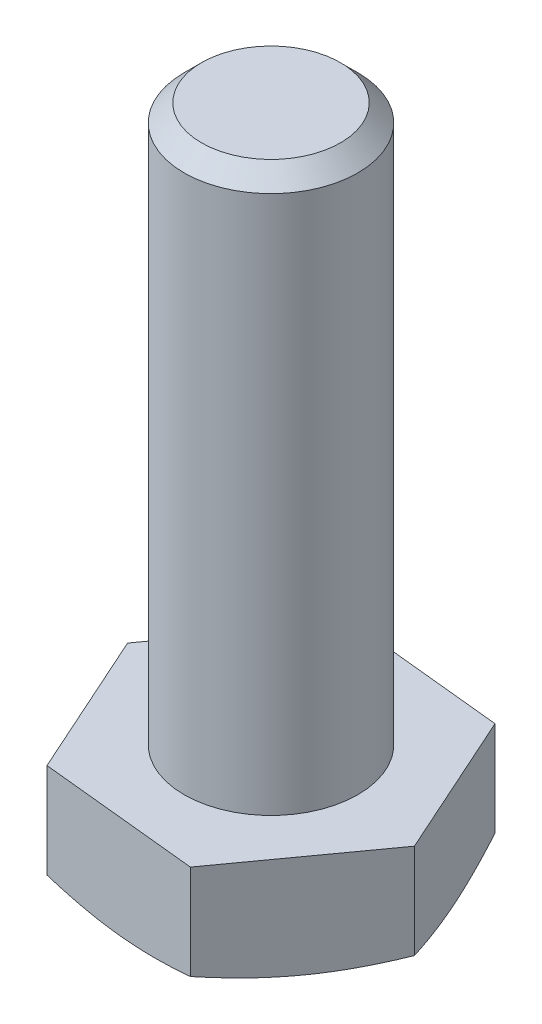
ISO-10303-21;
HEADER;
FILE_DESCRIPTION(('STEP AP214'),'2;1');
FILE_NAME('part.step','',(''),(''),'','','');
FILE_SCHEMA(('AUTOMOTIVE_DESIGN { 1 0 10303 214 1 1 1 1 }'));
ENDSEC;
DATA;
#1=APPLICATION_CONTEXT('core data for automotive mechanical design processes');
#2=APPLICATION_PROTOCOL_DEFINITION('international standard','automotive_design',2000,#1);
#3=PRODUCT_CONTEXT('',#1,'mechanical');
#4=PRODUCT('Part','Part','',(#3));
#5=PRODUCT_RELATED_PRODUCT_CATEGORY('part','',(#4));
#6=PRODUCT_DEFINITION_FORMATION('','',#4);
#7=PRODUCT_DEFINITION_CONTEXT('part definition',#1,'design');
#8=PRODUCT_DEFINITION('design','',#6,#7);
#9=PRODUCT_DEFINITION_SHAPE('','',#8);
#10=(LENGTH_UNIT() NAMED_UNIT(*) SI_UNIT(.MILLI.,.METRE.));
#11=(NAMED_UNIT(*) PLANE_ANGLE_UNIT() SI_UNIT($,.RADIAN.));
#12=(NAMED_UNIT(*) SI_UNIT($,.STERADIAN.) SOLID_ANGLE_UNIT());
#13=UNCERTAINTY_MEASURE_WITH_UNIT(LENGTH_MEASURE(1.E-05),#10,'distance_accuracy_value','');
#14=(GEOMETRIC_REPRESENTATION_CONTEXT(3) GLOBAL_UNCERTAINTY_ASSIGNED_CONTEXT((#13)) GLOBAL_UNIT_ASSIGNED_CONTEXT((#10,
#11,#12)) REPRESENTATION_CONTEXT('',''));
#15=CARTESIAN_POINT('',(0.,0.,0.));
#16=DIRECTION('',(0.,0.,1.));
#17=DIRECTION('',(1.,0.,0.));
#18=AXIS2_PLACEMENT_3D('',#15,#16,#17);
#19=CARTESIAN_POINT('',(2.70244681219402,-3.5,-3.74567945246195));
#20=DIRECTION('',(-0.912190472319559,0.,0.409766448369579));
#21=DIRECTION('',(0.409766448369579,0.,0.912190472319559));
#22=AXIS2_PLACEMENT_3D('',#19,#20,#21);
#23=PLANE('',#22);
#24=CARTESIAN_POINT('',(2.70235696989446,-2.72877918171655,-3.74587945246195));
#25=CARTESIAN_POINT('',(2.78074234099476,-2.76360554364033,-3.57138398322227));
#26=CARTESIAN_POINT('',(2.85938620266857,-2.79528621557615,-3.39631308219876));
#27=CARTESIAN_POINT('',(3.01718530506971,-2.85102354018129,-3.04503288753266));
#28=CARTESIAN_POINT('',(3.09634089685527,-2.8750742262591,-2.86882281239134));
#29=CARTESIAN_POINT('',(3.25428496315666,-2.91397555217697,-2.51721991026795));
#30=CARTESIAN_POINT('',(3.33306983015927,-2.92891104644854,-2.34183511405366));
#31=CARTESIAN_POINT('',(3.49082381468703,-2.94894374989199,-1.99065535731849));
#32=CARTESIAN_POINT('',(3.56979285198263,-2.9540446486007,-1.8148605753984));
#33=CARTESIAN_POINT('',(3.72773092657384,-2.9540446486007,-1.46327101155823));
#34=CARTESIAN_POINT('',(3.80669996386945,-2.94894374989199,-1.28747622963815));
#35=CARTESIAN_POINT('',(3.9644539483972,-2.92891104644854,-0.93629647290297));
#36=CARTESIAN_POINT('',(4.04323881539982,-2.91397555217697,-0.760911676688684));
#37=CARTESIAN_POINT('',(4.20118288170121,-2.8750742262591,-0.409308774565296));
#38=CARTESIAN_POINT('',(4.28033847348676,-2.85102354018129,-0.23309869942397));
#39=CARTESIAN_POINT('',(4.43813757588791,-2.79528621557615,0.11818149524213));
#40=CARTESIAN_POINT('',(4.51678143756171,-2.76360554364033,0.293252396265631));
#41=CARTESIAN_POINT('',(4.59516680866202,-2.72877918171655,0.467747865505321));
#42=B_SPLINE_CURVE_WITH_KNOTS('',3,(#24,#25,#26,#27,#28,#29,#30,#31,#32,#33,#34,#35,#36,#37,#38,
#39,#40,#41),.UNSPECIFIED.,.F.,.F.,(4,2,2,2,2,2,2,2,4),(0.,0.583371669310087,1.16719841276425,
1.74550386907207,2.32359232664833,2.90168078422459,3.47998624053242,4.06381298398658,
4.64718465329667),.UNSPECIFIED.);
#43=CARTESIAN_POINT('',(2.70244681219402,-2.72881908382068,-3.74567945246195));
#44=VERTEX_POINT('',#43);
#45=CARTESIAN_POINT('',(4.59507696636245,-2.72881908382068,0.467547865505321));
#46=VERTEX_POINT('',#45);
#47=EDGE_CURVE('E85',#44,#46,#42,.T.);
#48=ORIENTED_EDGE('',*,*,#47,.F.);
#49=DIRECTION('',(0.,1.,0.));
#50=VECTOR('',#49,1.);
#51=CARTESIAN_POINT('',(2.70244681219402,-3.5,-3.74567945246195));
#52=LINE('',#51,#50);
#53=CARTESIAN_POINT('',(2.70244681219402,0.,-3.74567945246195));
#54=VERTEX_POINT('',#53);
#55=EDGE_CURVE('E54',#44,#54,#52,.T.);
#56=ORIENTED_EDGE('',*,*,#55,.T.);
#57=DIRECTION('',(0.409766448369579,0.,0.912190472319559));
#58=VECTOR('',#57,1.);
#59=CARTESIAN_POINT('',(2.70244681219402,0.,-3.74567945246195));
#60=LINE('',#59,#58);
#61=CARTESIAN_POINT('',(4.59507696636245,0.,0.467547865505321));
#62=VERTEX_POINT('',#61);
#63=EDGE_CURVE('E93',#54,#62,#60,.T.);
#64=ORIENTED_EDGE('',*,*,#63,.T.);
#65=DIRECTION('',(0.,1.,0.));
#66=VECTOR('',#65,1.);
#67=CARTESIAN_POINT('',(4.59507696636245,-3.5,0.467547865505321));
#68=LINE('',#67,#66);
#69=EDGE_CURVE('E92',#46,#62,#68,.T.);
#70=ORIENTED_EDGE('',*,*,#69,.F.);
#71=EDGE_LOOP('',(#48,#56,#64,#70));
#72=FACE_BOUND('',#71,.T.);
#73=ADVANCED_FACE('F31',(#72),#23,.F.);
#74=CARTESIAN_POINT('',(4.59507696636245,-3.5,0.467547865505321));
#75=DIRECTION('',(-0.81096339006636,0.,-0.585096897934074));
#76=DIRECTION('',(-0.585096897934074,0.,0.81096339006636));
#77=AXIS2_PLACEMENT_3D('',#74,#75,#76);
#78=PLANE('',#77);
#79=CARTESIAN_POINT('',(4.59522126311002,-2.72877420080698,0.467347865505321));
#80=CARTESIAN_POINT('',(4.48329512346583,-2.76360128047606,0.622481146784698));
#81=CARTESIAN_POINT('',(4.37099988167168,-2.7952826286654,0.778126015686344));
#82=CARTESIAN_POINT('',(4.14567918833915,-2.85102117165813,1.09042784801914));
#83=CARTESIAN_POINT('',(4.03265323549784,-2.87507239952064,1.24708550627253));
#84=CARTESIAN_POINT('',(3.80712554589694,-2.91397461206453,1.55967424218681));
#85=CARTESIAN_POINT('',(3.69462896050121,-2.92891045468416,1.71559817988932));
#86=CARTESIAN_POINT('',(3.46937269378091,-2.94894362806483,2.02781071483558));
#87=CARTESIAN_POINT('',(3.35661312702318,-2.9540446486007,2.18409915328594));
#88=CARTESIAN_POINT('',(3.13109399350771,-2.9540446486007,2.49667603018666));
#89=CARTESIAN_POINT('',(3.01833442674997,-2.94894362806483,2.65296446863702));
#90=CARTESIAN_POINT('',(2.79307816002967,-2.92891045468416,2.96517700358328));
#91=CARTESIAN_POINT('',(2.68058157463395,-2.91397461206453,3.12110094128579));
#92=CARTESIAN_POINT('',(2.45505388503304,-2.87507239952064,3.43368967720007));
#93=CARTESIAN_POINT('',(2.34202793219173,-2.85102117165814,3.59034733545346));
#94=CARTESIAN_POINT('',(2.11670723885921,-2.7952826286654,3.90264916778625));
#95=CARTESIAN_POINT('',(2.00441199706505,-2.76360128047607,4.0582940366879));
#96=CARTESIAN_POINT('',(1.89248585742086,-2.72877420080698,4.21342731796728));
#97=B_SPLINE_CURVE_WITH_KNOTS('',3,(#79,#80,#81,#82,#83,#84,#85,#86,#87,#88,#89,#90,#91,#92,#93,
#94,#95,#96),.UNSPECIFIED.,.F.,.F.,(4,2,2,2,2,2,2,2,4),(0.,0.583378696848026,1.16721249190064,
1.74552482011727,2.3236201380217,2.90171545592612,3.48002778414276,4.06386157919537,
4.6472402760434),.UNSPECIFIED.);
#98=CARTESIAN_POINT('',(1.89263015416843,-2.72881908382068,4.21322731796728));
#99=VERTEX_POINT('',#98);
#100=EDGE_CURVE('E94',#46,#99,#97,.T.);
#101=ORIENTED_EDGE('',*,*,#100,.F.);
#102=ORIENTED_EDGE('',*,*,#69,.T.);
#103=DIRECTION('',(-0.585096897934074,0.,0.81096339006636));
#104=VECTOR('',#103,1.);
#105=CARTESIAN_POINT('',(4.59507696636245,0.,0.467547865505321));
#106=LINE('',#105,#104);
#107=CARTESIAN_POINT('',(1.89263015416843,0.,4.21322731796728));
#108=VERTEX_POINT('',#107);
#109=EDGE_CURVE('E289',#62,#108,#106,.T.);
#110=ORIENTED_EDGE('',*,*,#109,.T.);
#111=DIRECTION('',(0.,1.,0.));
#112=VECTOR('',#111,1.);
#113=CARTESIAN_POINT('',(1.89263015416843,-3.5,4.21322731796728));
#114=LINE('',#113,#112);
#115=EDGE_CURVE('E111',#99,#108,#114,.T.);
#116=ORIENTED_EDGE('',*,*,#115,.F.);
#117=EDGE_LOOP('',(#101,#102,#110,#116));
#118=FACE_BOUND('',#117,.T.);
#119=ADVANCED_FACE('F134',(#118),#78,.F.);
#120=CARTESIAN_POINT('',(1.89263015416843,-3.5,4.21322731796728));
#121=DIRECTION('',(0.1012270822532,0.,-0.994863346303654));
#122=DIRECTION('',(-0.994863346303654,0.,-0.1012270822532));
#123=AXIS2_PLACEMENT_3D('',#120,#121,#122);
#124=PLANE('',#123);
#125=CARTESIAN_POINT('',(1.89283015416843,-2.72878249767881,4.21324766791436));
#126=CARTESIAN_POINT('',(1.70252144908657,-2.76360838177381,4.1938838075265));
#127=CARTESIAN_POINT('',(1.51158517024263,-2.79528860350394,4.1744560916744));
#128=CARTESIAN_POINT('',(1.12847107139231,-2.85102511698631,4.13547433348543));
#129=CARTESIAN_POINT('',(0.936292399097913,-2.87507544237967,4.11592020442847));
#130=CARTESIAN_POINT('',(0.552826351511705,-2.91397617804077,4.07690263554875));
#131=CARTESIAN_POINT('',(0.361547734518012,-2.92891144040551,4.05744008688049));
#132=CARTESIAN_POINT('',(-0.0214568278398282,-2.94894383099629,4.01846947400064));
#133=CARTESIAN_POINT('',(-0.213182578426313,-2.9540446486007,3.99896142960763));
#134=CARTESIAN_POINT('',(-0.596634079599281,-2.9540446486007,3.9599453408216));
#135=CARTESIAN_POINT('',(-0.788359830185766,-2.94894383099629,3.94043729642859));
#136=CARTESIAN_POINT('',(-1.17136439254361,-2.92891144040551,3.90146668354874));
#137=CARTESIAN_POINT('',(-1.3626430095373,-2.91397617804077,3.88200413488049));
#138=CARTESIAN_POINT('',(-1.74610905712351,-2.87507544237967,3.84298656600076));
#139=CARTESIAN_POINT('',(-1.93828772941791,-2.85102511698631,3.8234324369438));
#140=CARTESIAN_POINT('',(-2.32140182826822,-2.79528860350394,3.78445067875483));
#141=CARTESIAN_POINT('',(-2.51233810711217,-2.76360838177381,3.76502296290273));
#142=CARTESIAN_POINT('',(-2.70264681219402,-2.72878249767881,3.74565910251487));
#143=B_SPLINE_CURVE_WITH_KNOTS('',3,(#125,#126,#127,#128,#129,#130,#131,#132,#133,#134,#135,
#136,#137,#138,#139,#140,#141,#142),.UNSPECIFIED.,.F.,.F.,(4,2,2,2,2,2,2,2,4),(0.,
0.583366990804255,1.16718903973507,1.7454899211441,2.32357381153101,2.90165770191791,
3.47995858332694,4.06378063225776,4.64714762306201),.UNSPECIFIED.);
#144=CARTESIAN_POINT('',(-2.70244681219402,-2.72881908382068,3.74567945246195));
#145=VERTEX_POINT('',#144);
#146=EDGE_CURVE('E182',#99,#145,#143,.T.);
#147=ORIENTED_EDGE('',*,*,#146,.F.);
#148=ORIENTED_EDGE('',*,*,#115,.T.);
#149=DIRECTION('',(-0.994863346303654,0.,-0.1012270822532));
#150=VECTOR('',#149,1.);
#151=CARTESIAN_POINT('',(1.89263015416843,0.,4.21322731796728));
#152=LINE('',#151,#150);
#153=CARTESIAN_POINT('',(-2.70244681219402,0.,3.74567945246195));
#154=VERTEX_POINT('',#153);
#155=EDGE_CURVE('E286',#108,#154,#152,.T.);
#156=ORIENTED_EDGE('',*,*,#155,.T.);
#157=DIRECTION('',(0.,1.,0.));
#158=VECTOR('',#157,1.);
#159=CARTESIAN_POINT('',(-2.70244681219402,-3.5,3.74567945246195));
#160=LINE('',#159,#158);
#161=EDGE_CURVE('E109',#145,#154,#160,.T.);
#162=ORIENTED_EDGE('',*,*,#161,.F.);
#163=EDGE_LOOP('',(#147,#148,#156,#162));
#164=FACE_BOUND('',#163,.T.);
#165=ADVANCED_FACE('F139',(#164),#124,.F.);
#166=CARTESIAN_POINT('',(-2.70244681219402,-3.5,3.74567945246195));
#167=DIRECTION('',(0.912190472319559,0.,-0.409766448369579));
#168=DIRECTION('',(-0.409766448369579,0.,-0.912190472319559));
#169=AXIS2_PLACEMENT_3D('',#166,#167,#168);
#170=PLANE('',#169);
#171=CARTESIAN_POINT('',(-2.70235696989446,-2.72877918171656,3.74587945246195));
#172=CARTESIAN_POINT('',(-2.78074234099476,-2.76360554364033,3.57138398322227));
#173=CARTESIAN_POINT('',(-2.85938620266857,-2.79528621557615,3.39631308219876));
#174=CARTESIAN_POINT('',(-3.01718530506971,-2.85102354018129,3.04503288753266));
#175=CARTESIAN_POINT('',(-3.09634089685527,-2.8750742262591,2.86882281239134));
#176=CARTESIAN_POINT('',(-3.25428496315666,-2.91397555217698,2.51721991026795));
#177=CARTESIAN_POINT('',(-3.33306983015927,-2.92891104644854,2.34183511405366));
#178=CARTESIAN_POINT('',(-3.49082381468703,-2.94894374989199,1.99065535731849));
#179=CARTESIAN_POINT('',(-3.56979285198263,-2.9540446486007,1.8148605753984));
#180=CARTESIAN_POINT('',(-3.72773092657384,-2.9540446486007,1.46327101155823));
#181=CARTESIAN_POINT('',(-3.80669996386945,-2.94894374989199,1.28747622963815));
#182=CARTESIAN_POINT('',(-3.9644539483972,-2.92891104644854,0.936296472902969));
#183=CARTESIAN_POINT('',(-4.04323881539982,-2.91397555217698,0.760911676688683));
#184=CARTESIAN_POINT('',(-4.20118288170121,-2.8750742262591,0.409308774565295));
#185=CARTESIAN_POINT('',(-4.28033847348676,-2.85102354018129,0.23309869942397));
#186=CARTESIAN_POINT('',(-4.43813757588791,-2.79528621557615,-0.11818149524213));
#187=CARTESIAN_POINT('',(-4.51678143756171,-2.76360554364033,-0.293252396265632));
#188=CARTESIAN_POINT('',(-4.59516680866202,-2.72877918171655,-0.467747865505322));
#189=B_SPLINE_CURVE_WITH_KNOTS('',3,(#171,#172,#173,#174,#175,#176,#177,#178,#179,#180,#181,
#182,#183,#184,#185,#186,#187,#188),.UNSPECIFIED.,.F.,.F.,(4,2,2,2,2,2,2,2,4),(0.,
0.583371669310087,1.16719841276425,1.74550386907207,2.32359232664833,2.90168078422459,
3.47998624053242,4.06381298398658,4.64718465329667),.UNSPECIFIED.);
#190=CARTESIAN_POINT('',(-4.59507696636245,-2.72881908382068,-0.467547865505321));
#191=VERTEX_POINT('',#190);
#192=EDGE_CURVE('E177',#145,#191,#189,.T.);
#193=ORIENTED_EDGE('',*,*,#192,.F.);
#194=ORIENTED_EDGE('',*,*,#161,.T.);
#195=DIRECTION('',(-0.409766448369579,0.,-0.912190472319559));
#196=VECTOR('',#195,1.);
#197=CARTESIAN_POINT('',(-2.70244681219402,0.,3.74567945246195));
#198=LINE('',#197,#196);
#199=CARTESIAN_POINT('',(-4.59507696636245,0.,-0.467547865505321));
#200=VERTEX_POINT('',#199);
#201=EDGE_CURVE('E282',#154,#200,#198,.T.);
#202=ORIENTED_EDGE('',*,*,#201,.T.);
#203=DIRECTION('',(0.,1.,0.));
#204=VECTOR('',#203,1.);
#205=CARTESIAN_POINT('',(-4.59507696636245,-3.5,-0.467547865505321));
#206=LINE('',#205,#204);
#207=EDGE_CURVE('E102',#191,#200,#206,.T.);
#208=ORIENTED_EDGE('',*,*,#207,.F.);
#209=EDGE_LOOP('',(#193,#194,#202,#208));
#210=FACE_BOUND('',#209,.T.);
#211=ADVANCED_FACE('F188',(#210),#170,.F.);
#212=CARTESIAN_POINT('',(-4.59507696636245,-3.5,-0.467547865505321));
#213=DIRECTION('',(0.81096339006636,0.,0.585096897934075));
#214=DIRECTION('',(0.585096897934075,0.,-0.81096339006636));
#215=AXIS2_PLACEMENT_3D('',#212,#213,#214);
#216=PLANE('',#215);
#217=CARTESIAN_POINT('',(-4.59522126311002,-2.72877420080698,-0.467347865505321));
#218=CARTESIAN_POINT('',(-4.48329512346583,-2.76360128047606,-0.622481146784699));
#219=CARTESIAN_POINT('',(-4.37099988167167,-2.7952826286654,-0.778126015686345));
#220=CARTESIAN_POINT('',(-4.14567918833915,-2.85102117165813,-1.09042784801914));
#221=CARTESIAN_POINT('',(-4.03265323549784,-2.87507239952064,-1.24708550627253));
#222=CARTESIAN_POINT('',(-3.80712554589693,-2.91397461206453,-1.55967424218681));
#223=CARTESIAN_POINT('',(-3.69462896050121,-2.92891045468415,-1.71559817988932));
#224=CARTESIAN_POINT('',(-3.46937269378091,-2.94894362806483,-2.02781071483558));
#225=CARTESIAN_POINT('',(-3.35661312702317,-2.9540446486007,-2.18409915328594));
#226=CARTESIAN_POINT('',(-3.13109399350771,-2.9540446486007,-2.49667603018666));
#227=CARTESIAN_POINT('',(-3.01833442674997,-2.94894362806483,-2.65296446863702));
#228=CARTESIAN_POINT('',(-2.79307816002967,-2.92891045468415,-2.96517700358328));
#229=CARTESIAN_POINT('',(-2.68058157463394,-2.91397461206453,-3.12110094128579));
#230=CARTESIAN_POINT('',(-2.45505388503304,-2.87507239952064,-3.43368967720007));
#231=CARTESIAN_POINT('',(-2.34202793219173,-2.85102117165813,-3.59034733545346));
#232=CARTESIAN_POINT('',(-2.11670723885921,-2.7952826286654,-3.90264916778625));
#233=CARTESIAN_POINT('',(-2.00441199706505,-2.76360128047606,-4.0582940366879));
#234=CARTESIAN_POINT('',(-1.89248585742086,-2.72877420080698,-4.21342731796728));
#235=B_SPLINE_CURVE_WITH_KNOTS('',3,(#217,#218,#219,#220,#221,#222,#223,#224,#225,#226,#227,
#228,#229,#230,#231,#232,#233,#234),.UNSPECIFIED.,.F.,.F.,(4,2,2,2,2,2,2,2,4),(0.,
0.583378696848027,1.16721249190064,1.74552482011727,2.3236201380217,2.90171545592612,
3.48002778414276,4.06386157919537,4.64724027604339),.UNSPECIFIED.);
#236=CARTESIAN_POINT('',(-1.89263015416843,-2.72881908382068,-4.21322731796728));
#237=VERTEX_POINT('',#236);
#238=EDGE_CURVE('E46',#191,#237,#235,.T.);
#239=ORIENTED_EDGE('',*,*,#238,.F.);
#240=ORIENTED_EDGE('',*,*,#207,.T.);
#241=DIRECTION('',(0.585096897934075,0.,-0.81096339006636));
#242=VECTOR('',#241,1.);
#243=CARTESIAN_POINT('',(-4.59507696636245,0.,-0.467547865505321));
#244=LINE('',#243,#242);
#245=CARTESIAN_POINT('',(-1.89263015416843,0.,-4.21322731796728));
#246=VERTEX_POINT('',#245);
#247=EDGE_CURVE('E104',#200,#246,#244,.T.);
#248=ORIENTED_EDGE('',*,*,#247,.T.);
#249=DIRECTION('',(0.,1.,0.));
#250=VECTOR('',#249,1.);
#251=CARTESIAN_POINT('',(-1.89263015416843,-3.5,-4.21322731796728));
#252=LINE('',#251,#250);
#253=EDGE_CURVE('E100',#237,#246,#252,.T.);
#254=ORIENTED_EDGE('',*,*,#253,.F.);
#255=EDGE_LOOP('',(#239,#240,#248,#254));
#256=FACE_BOUND('',#255,.T.);
#257=ADVANCED_FACE('F192',(#256),#216,.F.);
#258=CARTESIAN_POINT('',(-1.89263015416843,-3.5,-4.21322731796728));
#259=DIRECTION('',(-0.1012270822532,0.,0.994863346303654));
#260=DIRECTION('',(0.994863346303654,0.,0.1012270822532));
#261=AXIS2_PLACEMENT_3D('',#258,#259,#260);
#262=PLANE('',#261);
#263=CARTESIAN_POINT('',(-1.89283015416843,-2.72878249767881,-4.21324766791436));
#264=CARTESIAN_POINT('',(-1.70252144908657,-2.76360838177381,-4.1938838075265));
#265=CARTESIAN_POINT('',(-1.51158517024263,-2.79528860350394,-4.1744560916744));
#266=CARTESIAN_POINT('',(-1.12847107139231,-2.85102511698631,-4.13547433348543));
#267=CARTESIAN_POINT('',(-0.936292399097911,-2.87507544237967,-4.11592020442847));
#268=CARTESIAN_POINT('',(-0.552826351511703,-2.91397617804077,-4.07690263554875));
#269=CARTESIAN_POINT('',(-0.36154773451801,-2.92891144040551,-4.05744008688049));
#270=CARTESIAN_POINT('',(0.02145682783983,-2.94894383099629,-4.01846947400064));
#271=CARTESIAN_POINT('',(0.213182578426314,-2.9540446486007,-3.99896142960763));
#272=CARTESIAN_POINT('',(0.596634079599283,-2.9540446486007,-3.9599453408216));
#273=CARTESIAN_POINT('',(0.788359830185767,-2.94894383099629,-3.94043729642859));
#274=CARTESIAN_POINT('',(1.17136439254361,-2.92891144040551,-3.90146668354874));
#275=CARTESIAN_POINT('',(1.3626430095373,-2.91397617804077,-3.88200413488049));
#276=CARTESIAN_POINT('',(1.74610905712351,-2.87507544237967,-3.84298656600076));
#277=CARTESIAN_POINT('',(1.93828772941791,-2.85102511698631,-3.8234324369438));
#278=CARTESIAN_POINT('',(2.32140182826822,-2.79528860350394,-3.78445067875483));
#279=CARTESIAN_POINT('',(2.51233810711217,-2.76360838177381,-3.76502296290273));
#280=CARTESIAN_POINT('',(2.70264681219403,-2.72878249767881,-3.74565910251487));
#281=B_SPLINE_CURVE_WITH_KNOTS('',3,(#263,#264,#265,#266,#267,#268,#269,#270,#271,#272,#273,
#274,#275,#276,#277,#278,#279,#280),.UNSPECIFIED.,.F.,.F.,(4,2,2,2,2,2,2,2,4),(0.,
0.583366990804254,1.16718903973507,1.7454899211441,2.32357381153101,2.90165770191791,
3.47995858332694,4.06378063225776,4.64714762306201),.UNSPECIFIED.);
#282=EDGE_CURVE('E83',#237,#44,#281,.T.);
#283=ORIENTED_EDGE('',*,*,#282,.F.);
#284=ORIENTED_EDGE('',*,*,#253,.T.);
#285=DIRECTION('',(0.994863346303654,0.,0.1012270822532));
#286=VECTOR('',#285,1.);
#287=CARTESIAN_POINT('',(-1.89263015416843,0.,-4.21322731796728));
#288=LINE('',#287,#286);
#289=EDGE_CURVE('E98',#246,#54,#288,.T.);
#290=ORIENTED_EDGE('',*,*,#289,.T.);
#291=ORIENTED_EDGE('',*,*,#55,.F.);
#292=EDGE_LOOP('',(#283,#284,#290,#291));
#293=FACE_BOUND('',#292,.T.);
#294=ADVANCED_FACE('F96',(#293),#262,.F.);
#295=CARTESIAN_POINT('',(0.,16.,0.));
#296=DIRECTION('',(0.,-1.,0.));
#297=DIRECTION('',(0.,0.,-1.));
#298=AXIS2_PLACEMENT_3D('',#295,#296,#297);
#299=CYLINDRICAL_SURFACE('',#298,2.5);
#300=CARTESIAN_POINT('',(0.,15.5,0.));
#301=DIRECTION('',(0.,1.,0.));
#302=DIRECTION('',(0.,0.,1.));
#303=AXIS2_PLACEMENT_3D('',#300,#301,#302);
#304=CIRCLE('',#303,2.5);
#305=CARTESIAN_POINT('',(0.,15.5,2.5));
#306=VERTEX_POINT('',#305);
#307=EDGE_CURVE('E11',#306,#306,#304,.F.);
#308=ORIENTED_EDGE('',*,*,#307,.T.);
#309=EDGE_LOOP('',(#308));
#310=FACE_BOUND('',#309,.T.);
#311=CARTESIAN_POINT('',(0.,0.,0.));
#312=DIRECTION('',(0.,-1.,0.));
#313=DIRECTION('',(0.,0.,-1.));
#314=AXIS2_PLACEMENT_3D('',#311,#312,#313);
#315=CIRCLE('',#314,2.5);
#316=CARTESIAN_POINT('',(0.,0.,-2.5));
#317=VERTEX_POINT('',#316);
#318=EDGE_CURVE('E114',#317,#317,#315,.T.);
#319=ORIENTED_EDGE('',*,*,#318,.F.);
#320=EDGE_LOOP('',(#319));
#321=FACE_BOUND('',#320,.T.);
#322=ADVANCED_FACE('F130',(#310,#321),#299,.T.);
#323=CARTESIAN_POINT('',(0.,16.,0.));
#324=DIRECTION('',(0.,1.,0.));
#325=DIRECTION('',(0.,0.,1.));
#326=AXIS2_PLACEMENT_3D('',#323,#324,#325);
#327=PLANE('',#326);
#328=CARTESIAN_POINT('',(0.,16.,0.));
#329=DIRECTION('',(0.,1.,0.));
#330=DIRECTION('',(0.,0.,1.));
#331=AXIS2_PLACEMENT_3D('',#328,#329,#330);
#332=CIRCLE('',#331,2.);
#333=CARTESIAN_POINT('',(0.,16.,2.));
#334=VERTEX_POINT('',#333);
#335=EDGE_CURVE('E39',#334,#334,#332,.T.);
#336=ORIENTED_EDGE('',*,*,#335,.T.);
#337=EDGE_LOOP('',(#336));
#338=FACE_BOUND('',#337,.T.);
#339=ADVANCED_FACE('F119',(#338),#327,.T.);
#340=CARTESIAN_POINT('',(0.,16.,0.));
#341=DIRECTION('',(0.,-1.,0.));
#342=DIRECTION('',(0.,0.,-1.));
#343=AXIS2_PLACEMENT_3D('',#340,#341,#342);
#344=CONICAL_SURFACE('',#343,2.,0.785398163397446);
#345=ORIENTED_EDGE('',*,*,#307,.F.);
#346=EDGE_LOOP('',(#345));
#347=FACE_BOUND('',#346,.T.);
#348=ORIENTED_EDGE('',*,*,#335,.F.);
#349=EDGE_LOOP('',(#348));
#350=FACE_BOUND('',#349,.T.);
#351=ADVANCED_FACE('F33',(#347,#350),#344,.T.);
#352=CARTESIAN_POINT('',(4.59507696636245,0.,0.467547865505321));
#353=DIRECTION('',(0.,-1.,0.));
#354=DIRECTION('',(0.,0.,-1.));
#355=AXIS2_PLACEMENT_3D('',#352,#353,#354);
#356=PLANE('',#355);
#357=ORIENTED_EDGE('',*,*,#63,.F.);
#358=ORIENTED_EDGE('',*,*,#289,.F.);
#359=ORIENTED_EDGE('',*,*,#247,.F.);
#360=ORIENTED_EDGE('',*,*,#201,.F.);
#361=ORIENTED_EDGE('',*,*,#155,.F.);
#362=ORIENTED_EDGE('',*,*,#109,.F.);
#363=EDGE_LOOP('',(#357,#358,#359,#360,#361,#362));
#364=FACE_BOUND('',#363,.T.);
#365=ORIENTED_EDGE('',*,*,#318,.T.);
#366=EDGE_LOOP('',(#365));
#367=FACE_BOUND('',#366,.T.);
#368=ADVANCED_FACE('F122',(#364,#367),#356,.F.);
#369=CARTESIAN_POINT('',(0.,-2.15558333189466,0.));
#370=DIRECTION('',(0.,1.,0.));
#371=DIRECTION('',(0.,0.,1.));
#372=AXIS2_PLACEMENT_3D('',#369,#370,#371);
#373=CONICAL_SURFACE('',#372,6.19375443795783,1.22173047639603);
#374=CARTESIAN_POINT('',(0.,-3.5,0.));
#375=DIRECTION('',(0.,1.,0.));
#376=DIRECTION('',(0.,0.,1.));
#377=AXIS2_PLACEMENT_3D('',#374,#375,#376);
#378=CIRCLE('',#377,2.5);
#379=CARTESIAN_POINT('',(0.,-3.5,2.5));
#380=VERTEX_POINT('',#379);
#381=EDGE_CURVE('E89',#380,#380,#378,.T.);
#382=ORIENTED_EDGE('',*,*,#381,.T.);
#383=EDGE_LOOP('',(#382));
#384=FACE_BOUND('',#383,.T.);
#385=ORIENTED_EDGE('',*,*,#47,.T.);
#386=ORIENTED_EDGE('',*,*,#100,.T.);
#387=ORIENTED_EDGE('',*,*,#146,.T.);
#388=ORIENTED_EDGE('',*,*,#192,.T.);
#389=ORIENTED_EDGE('',*,*,#238,.T.);
#390=ORIENTED_EDGE('',*,*,#282,.T.);
#391=EDGE_LOOP('',(#385,#386,#387,#388,#389,#390));
#392=FACE_BOUND('',#391,.T.);
#393=ADVANCED_FACE('F84',(#384,#392),#373,.T.);
#394=CARTESIAN_POINT('',(4.59507696636245,-3.5,0.467547865505321));
#395=DIRECTION('',(0.,-1.,0.));
#396=DIRECTION('',(0.,0.,-1.));
#397=AXIS2_PLACEMENT_3D('',#394,#395,#396);
#398=PLANE('',#397);
#399=ORIENTED_EDGE('',*,*,#381,.F.);
#400=EDGE_LOOP('',(#399));
#401=FACE_BOUND('',#400,.T.);
#402=ADVANCED_FACE('F159',(#401),#398,.T.);
#403=CLOSED_SHELL('',(#73,#119,#165,#211,#257,#294,#322,#339,#351,#368,#393,#402));
#404=MANIFOLD_SOLID_BREP('B2',#403);
#405=ADVANCED_BREP_SHAPE_REPRESENTATION('',(#18,#404),#14);
#406=SHAPE_DEFINITION_REPRESENTATION(#9,#405);
ENDSEC;
END-ISO-10303-21;
